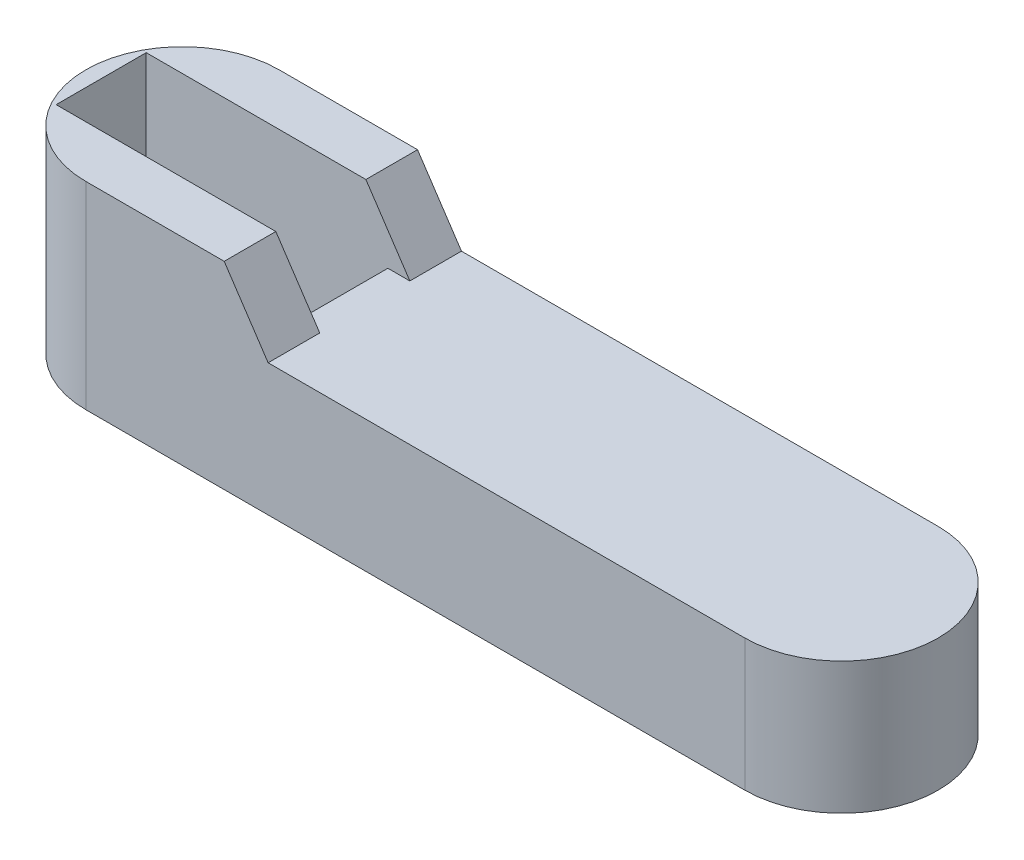
ISO-10303-21;
HEADER;
FILE_DESCRIPTION(('STEP AP214'),'2;1');
FILE_NAME('part.step','',(''),(''),'','','');
FILE_SCHEMA(('AUTOMOTIVE_DESIGN { 1 0 10303 214 1 1 1 1 }'));
ENDSEC;
DATA;
#1=APPLICATION_CONTEXT('core data for automotive mechanical design processes');
#2=APPLICATION_PROTOCOL_DEFINITION('international standard','automotive_design',2000,#1);
#3=PRODUCT_CONTEXT('',#1,'mechanical');
#4=PRODUCT('Part','Part','',(#3));
#5=PRODUCT_RELATED_PRODUCT_CATEGORY('part','',(#4));
#6=PRODUCT_DEFINITION_FORMATION('','',#4);
#7=PRODUCT_DEFINITION_CONTEXT('part definition',#1,'design');
#8=PRODUCT_DEFINITION('design','',#6,#7);
#9=PRODUCT_DEFINITION_SHAPE('','',#8);
#10=(LENGTH_UNIT() NAMED_UNIT(*) SI_UNIT(.MILLI.,.METRE.));
#11=(NAMED_UNIT(*) PLANE_ANGLE_UNIT() SI_UNIT($,.RADIAN.));
#12=(NAMED_UNIT(*) SI_UNIT($,.STERADIAN.) SOLID_ANGLE_UNIT());
#13=UNCERTAINTY_MEASURE_WITH_UNIT(LENGTH_MEASURE(1.E-05),#10,'distance_accuracy_value','');
#14=(GEOMETRIC_REPRESENTATION_CONTEXT(3) GLOBAL_UNCERTAINTY_ASSIGNED_CONTEXT((#13)) GLOBAL_UNIT_ASSIGNED_CONTEXT((#10,
#11,#12)) REPRESENTATION_CONTEXT('',''));
#15=CARTESIAN_POINT('',(0.,0.,0.));
#16=DIRECTION('',(0.,0.,1.));
#17=DIRECTION('',(1.,0.,0.));
#18=AXIS2_PLACEMENT_3D('',#15,#16,#17);
#19=CARTESIAN_POINT('',(150.,4.98,-22.0000000000001));
#20=DIRECTION('',(0.,1.,0.));
#21=DIRECTION('',(0.713138176121958,0.,0.701023495866899));
#22=AXIS2_PLACEMENT_3D('',#19,#20,#21);
#23=PLANE('',#22);
#24=CARTESIAN_POINT('',(150.,4.98,-22.0000000000001));
#25=DIRECTION('',(0.,1.,0.));
#26=DIRECTION('',(0.713138176121958,0.,0.701023495866899));
#27=AXIS2_PLACEMENT_3D('',#24,#25,#26);
#28=CIRCLE('',#27,5.61);
#29=CARTESIAN_POINT('',(154.000705168044,4.98,-18.0672581881868));
#30=VERTEX_POINT('',#29);
#31=EDGE_CURVE('E306',#30,#30,#28,.F.);
#32=ORIENTED_EDGE('',*,*,#31,.F.);
#33=EDGE_LOOP('',(#32));
#34=FACE_BOUND('',#33,.T.);
#35=DIRECTION('',(-0.713138176121948,0.,-0.701023495866908));
#36=VECTOR('',#35,1.);
#37=CARTESIAN_POINT('',(166.268455658429,4.98,-33.7679348859496));
#38=LINE('',#37,#36);
#39=CARTESIAN_POINT('',(166.268455658429,4.97999999999999,-33.7679348859496));
#40=VERTEX_POINT('',#39);
#41=CARTESIAN_POINT('',(161.487494681992,4.97999999999999,-38.4676776420183));
#42=VERTEX_POINT('',#41);
#43=EDGE_CURVE('E63',#40,#42,#38,.T.);
#44=ORIENTED_EDGE('',*,*,#43,.F.);
#45=DIRECTION('',(-0.605125535662141,0.,0.796130068575235));
#46=VECTOR('',#45,1.);
#47=CARTESIAN_POINT('',(159.130639993139,4.98,-24.3771071317262));
#48=LINE('',#47,#46);
#49=CARTESIAN_POINT('',(159.130639993139,4.98,-24.3771071317262));
#50=VERTEX_POINT('',#49);
#51=EDGE_CURVE('E240',#40,#50,#48,.T.);
#52=ORIENTED_EDGE('',*,*,#51,.T.);
#53=CARTESIAN_POINT('',(150.,4.98,-22.0000000000001));
#54=DIRECTION('',(0.,1.,0.));
#55=DIRECTION('',(0.713138176121958,0.,0.701023495866899));
#56=AXIS2_PLACEMENT_3D('',#53,#54,#55);
#57=CIRCLE('',#56,9.435);
#58=CARTESIAN_POINT('',(159.170024806677,4.98,-19.7796689334835));
#59=VERTEX_POINT('',#58);
#60=EDGE_CURVE('E251',#59,#50,#57,.T.);
#61=ORIENTED_EDGE('',*,*,#60,.F.);
#62=DIRECTION('',(0.618676117195959,0.,0.785646143000354));
#63=VECTOR('',#62,1.);
#64=CARTESIAN_POINT('',(169.252017964806,4.98000000000001,-6.97671950925164));
#65=LINE('',#64,#63);
#66=CARTESIAN_POINT('',(166.467677642019,4.98000000000001,-10.5125053180082));
#67=VERTEX_POINT('',#66);
#68=EDGE_CURVE('E503',#59,#67,#65,.T.);
#69=ORIENTED_EDGE('',*,*,#68,.T.);
#70=DIRECTION('',(0.701023495866891,0.,-0.713138176121965));
#71=VECTOR('',#70,1.);
#72=CARTESIAN_POINT('',(161.76793488595,4.98000000000001,-5.73154434157103));
#73=LINE('',#72,#71);
#74=CARTESIAN_POINT('',(161.76793488595,4.98000000000001,-5.73154434157101));
#75=VERTEX_POINT('',#74);
#76=EDGE_CURVE('E575',#75,#67,#73,.T.);
#77=ORIENTED_EDGE('',*,*,#76,.F.);
#78=DIRECTION('',(-0.796130068575241,0.,-0.605125535662133));
#79=VECTOR('',#78,1.);
#80=CARTESIAN_POINT('',(152.377107131726,4.98,-12.8693600068618));
#81=LINE('',#80,#79);
#82=CARTESIAN_POINT('',(152.377107131726,4.98,-12.8693600068618));
#83=VERTEX_POINT('',#82);
#84=EDGE_CURVE('E508',#75,#83,#81,.T.);
#85=ORIENTED_EDGE('',*,*,#84,.T.);
#86=CARTESIAN_POINT('',(150.,4.98,-22.0000000000001));
#87=DIRECTION('',(0.,1.,0.));
#88=DIRECTION('',(0.713138176121958,0.,0.701023495866899));
#89=AXIS2_PLACEMENT_3D('',#86,#87,#88);
#90=CIRCLE('',#89,9.435);
#91=CARTESIAN_POINT('',(147.779668933484,4.98,-12.8299751933236));
#92=VERTEX_POINT('',#91);
#93=EDGE_CURVE('E519',#92,#83,#90,.T.);
#94=ORIENTED_EDGE('',*,*,#93,.F.);
#95=DIRECTION('',(-0.785646143000356,0.,0.618676117195956));
#96=VECTOR('',#95,1.);
#97=CARTESIAN_POINT('',(134.976719509252,4.98,-2.74798203519463));
#98=LINE('',#97,#96);
#99=CARTESIAN_POINT('',(134.976719509252,4.98,-2.74798203519463));
#100=VERTEX_POINT('',#99);
#101=EDGE_CURVE('E526',#92,#100,#98,.T.);
#102=ORIENTED_EDGE('',*,*,#101,.T.);
#103=CARTESIAN_POINT('',(133.241333000517,4.98,-4.95171946631063));
#104=DIRECTION('',(0.,1.,0.));
#105=DIRECTION('',(0.713138176121958,0.,0.701023495866899));
#106=AXIS2_PLACEMENT_3D('',#103,#104,#105);
#107=CIRCLE('',#106,2.805);
#108=CARTESIAN_POINT('',(131.008188158164,4.98,-6.64909659384291));
#109=VERTEX_POINT('',#108);
#110=EDGE_CURVE('E530',#100,#109,#107,.F.);
#111=ORIENTED_EDGE('',*,*,#110,.T.);
#112=DIRECTION('',(0.605125535662135,0.,-0.796130068575239));
#113=VECTOR('',#112,1.);
#114=CARTESIAN_POINT('',(140.869360006862,4.98,-19.6228928682739));
#115=LINE('',#114,#113);
#116=CARTESIAN_POINT('',(140.869360006862,4.98,-19.6228928682739));
#117=VERTEX_POINT('',#116);
#118=EDGE_CURVE('E534',#109,#117,#115,.T.);
#119=ORIENTED_EDGE('',*,*,#118,.T.);
#120=CARTESIAN_POINT('',(150.,4.98,-22.0000000000001));
#121=DIRECTION('',(0.,1.,0.));
#122=DIRECTION('',(0.713138176121958,0.,0.701023495866899));
#123=AXIS2_PLACEMENT_3D('',#120,#121,#122);
#124=CIRCLE('',#123,9.435);
#125=CARTESIAN_POINT('',(140.829975193324,4.98,-24.2203310665166));
#126=VERTEX_POINT('',#125);
#127=EDGE_CURVE('E268',#126,#117,#124,.T.);
#128=ORIENTED_EDGE('',*,*,#127,.F.);
#129=DIRECTION('',(-0.618676117195959,0.,-0.785646143000354));
#130=VECTOR('',#129,1.);
#131=CARTESIAN_POINT('',(130.747982035195,4.97999999999999,-37.0232804907485));
#132=LINE('',#131,#130);
#133=CARTESIAN_POINT('',(130.747982035195,4.97999999999999,-37.0232804907485));
#134=VERTEX_POINT('',#133);
#135=EDGE_CURVE('E259',#126,#134,#132,.T.);
#136=ORIENTED_EDGE('',*,*,#135,.T.);
#137=CARTESIAN_POINT('',(132.951719466311,4.97999999999999,-38.7586669994831));
#138=DIRECTION('',(0.,1.,0.));
#139=DIRECTION('',(0.713138176121958,0.,0.701023495866899));
#140=AXIS2_PLACEMENT_3D('',#137,#138,#139);
#141=CIRCLE('',#140,2.805);
#142=CARTESIAN_POINT('',(134.649096593843,4.97999999999998,-40.9918118418367));
#143=VERTEX_POINT('',#142);
#144=EDGE_CURVE('E523',#134,#143,#141,.F.);
#145=ORIENTED_EDGE('',*,*,#144,.T.);
#146=DIRECTION('',(0.796130068575241,0.,0.605125535662133));
#147=VECTOR('',#146,1.);
#148=CARTESIAN_POINT('',(147.622892868274,4.97999999999999,-31.1306399931384));
#149=LINE('',#148,#147);
#150=CARTESIAN_POINT('',(147.622892868274,4.97999999999999,-31.1306399931384));
#151=VERTEX_POINT('',#150);
#152=EDGE_CURVE('E246',#143,#151,#149,.T.);
#153=ORIENTED_EDGE('',*,*,#152,.T.);
#154=CARTESIAN_POINT('',(150.,4.98,-22.0000000000001));
#155=DIRECTION('',(0.,1.,0.));
#156=DIRECTION('',(0.713138176121958,0.,0.701023495866899));
#157=AXIS2_PLACEMENT_3D('',#154,#155,#156);
#158=CIRCLE('',#157,9.435);
#159=CARTESIAN_POINT('',(152.220331066517,4.97999999999999,-31.1700248066765));
#160=VERTEX_POINT('',#159);
#161=EDGE_CURVE('E244',#160,#151,#158,.T.);
#162=ORIENTED_EDGE('',*,*,#161,.F.);
#163=DIRECTION('',(0.78564614300036,0.,-0.618676117195951));
#164=VECTOR('',#163,1.);
#165=CARTESIAN_POINT('',(165.023280490749,4.97999999999999,-41.2520179648054));
#166=LINE('',#165,#164);
#167=EDGE_CURVE('E231',#160,#42,#166,.T.);
#168=ORIENTED_EDGE('',*,*,#167,.T.);
#169=EDGE_LOOP('',(#44,#52,#61,#69,#77,#85,#94,#102,#111,#119,#128,#136,#145,#153,#162,#168));
#170=FACE_BOUND('',#169,.T.);
#171=ADVANCED_FACE('F47',(#34,#170),#23,.F.);
#172=CARTESIAN_POINT('',(159.130639993139,26.9860507242311,-24.3771071317262));
#173=DIRECTION('',(0.796130068575234,0.,0.605125535662141));
#174=DIRECTION('',(-0.605125535662141,0.,0.796130068575235));
#175=AXIS2_PLACEMENT_3D('',#172,#173,#174);
#176=PLANE('',#175);
#177=DIRECTION('',(0.,1.,0.));
#178=VECTOR('',#177,1.);
#179=CARTESIAN_POINT('',(166.268455658429,-8.4346735993157,-33.7679348859495));
#180=LINE('',#179,#178);
#181=CARTESIAN_POINT('',(166.268455658429,0.,-33.7679348859495));
#182=VERTEX_POINT('',#181);
#183=EDGE_CURVE('E70',#182,#40,#180,.T.);
#184=ORIENTED_EDGE('',*,*,#183,.F.);
#185=DIRECTION('',(-0.605125535662141,0.,0.796130068575234));
#186=VECTOR('',#185,1.);
#187=CARTESIAN_POINT('',(99.71548144673,0.,53.7921180294656));
#188=LINE('',#187,#186);
#189=CARTESIAN_POINT('',(159.130639993139,0.,-24.3771071317262));
#190=VERTEX_POINT('',#189);
#191=EDGE_CURVE('E483',#182,#190,#188,.T.);
#192=ORIENTED_EDGE('',*,*,#191,.T.);
#193=DIRECTION('',(0.,-1.,0.));
#194=VECTOR('',#193,1.);
#195=CARTESIAN_POINT('',(159.130639993139,26.9860507242311,-24.3771071317262));
#196=LINE('',#195,#194);
#197=EDGE_CURVE('E258',#50,#190,#196,.T.);
#198=ORIENTED_EDGE('',*,*,#197,.F.);
#199=ORIENTED_EDGE('',*,*,#51,.F.);
#200=EDGE_LOOP('',(#184,#192,#198,#199));
#201=FACE_BOUND('',#200,.T.);
#202=ADVANCED_FACE('F642',(#201),#176,.F.);
#203=CARTESIAN_POINT('',(165.023280490749,26.9860507242311,-41.2520179648054));
#204=DIRECTION('',(-0.61867611719595,0.,-0.785646143000361));
#205=DIRECTION('',(0.78564614300036,0.,-0.618676117195951));
#206=AXIS2_PLACEMENT_3D('',#203,#204,#205);
#207=PLANE('',#206);
#208=DIRECTION('',(0.,1.,0.));
#209=VECTOR('',#208,1.);
#210=CARTESIAN_POINT('',(161.487494681992,-8.4346735993157,-38.4676776420183));
#211=LINE('',#210,#209);
#212=CARTESIAN_POINT('',(161.487494681992,0.,-38.4676776420183));
#213=VERTEX_POINT('',#212);
#214=EDGE_CURVE('E238',#213,#42,#211,.T.);
#215=ORIENTED_EDGE('',*,*,#214,.T.);
#216=ORIENTED_EDGE('',*,*,#167,.F.);
#217=DIRECTION('',(0.,-1.,0.));
#218=VECTOR('',#217,1.);
#219=CARTESIAN_POINT('',(152.220331066517,26.9860507242311,-31.1700248066765));
#220=LINE('',#219,#218);
#221=CARTESIAN_POINT('',(152.220331066517,0.,-31.1700248066765));
#222=VERTEX_POINT('',#221);
#223=EDGE_CURVE('E235',#160,#222,#220,.T.);
#224=ORIENTED_EDGE('',*,*,#223,.T.);
#225=DIRECTION('',(0.785646143000361,0.,-0.61867611719595));
#226=VECTOR('',#225,1.);
#227=CARTESIAN_POINT('',(53.8066880330894,0.,46.3281861798965));
#228=LINE('',#227,#226);
#229=EDGE_CURVE('E449',#222,#213,#228,.T.);
#230=ORIENTED_EDGE('',*,*,#229,.T.);
#231=EDGE_LOOP('',(#215,#216,#224,#230));
#232=FACE_BOUND('',#231,.T.);
#233=ADVANCED_FACE('F233',(#232),#207,.F.);
#234=CARTESIAN_POINT('',(152.377107131726,26.9860507242311,-12.8693600068618));
#235=DIRECTION('',(-0.605125535662132,0.,0.796130068575241));
#236=DIRECTION('',(-0.796130068575241,0.,-0.605125535662133));
#237=AXIS2_PLACEMENT_3D('',#234,#235,#236);
#238=PLANE('',#237);
#239=DIRECTION('',(0.,1.,0.));
#240=VECTOR('',#239,1.);
#241=CARTESIAN_POINT('',(161.76793488595,-8.43467359931569,-5.73154434157103));
#242=LINE('',#241,#240);
#243=CARTESIAN_POINT('',(161.76793488595,0.,-5.73154434157103));
#244=VERTEX_POINT('',#243);
#245=EDGE_CURVE('E573',#244,#75,#242,.T.);
#246=ORIENTED_EDGE('',*,*,#245,.F.);
#247=DIRECTION('',(-0.796130068575241,0.,-0.605125535662132));
#248=VECTOR('',#247,1.);
#249=CARTESIAN_POINT('',(51.3982141875908,0.,-89.6217765972098));
#250=LINE('',#249,#248);
#251=CARTESIAN_POINT('',(152.377107131726,0.,-12.8693600068618));
#252=VERTEX_POINT('',#251);
#253=EDGE_CURVE('E480',#244,#252,#250,.T.);
#254=ORIENTED_EDGE('',*,*,#253,.T.);
#255=DIRECTION('',(0.,-1.,0.));
#256=VECTOR('',#255,1.);
#257=CARTESIAN_POINT('',(152.377107131726,26.9860507242311,-12.8693600068618));
#258=LINE('',#257,#256);
#259=EDGE_CURVE('E302',#83,#252,#258,.T.);
#260=ORIENTED_EDGE('',*,*,#259,.F.);
#261=ORIENTED_EDGE('',*,*,#84,.F.);
#262=EDGE_LOOP('',(#246,#254,#260,#261));
#263=FACE_BOUND('',#262,.T.);
#264=ADVANCED_FACE('F656',(#263),#238,.F.);
#265=CARTESIAN_POINT('',(169.252017964806,26.9860507242311,-6.97671950925165));
#266=DIRECTION('',(0.785646143000354,0.,-0.618676117195959));
#267=DIRECTION('',(0.618676117195959,0.,0.785646143000354));
#268=AXIS2_PLACEMENT_3D('',#265,#266,#267);
#269=PLANE('',#268);
#270=DIRECTION('',(0.,1.,0.));
#271=VECTOR('',#270,1.);
#272=CARTESIAN_POINT('',(166.467677642019,-8.43467359931569,-10.5125053180082));
#273=LINE('',#272,#271);
#274=CARTESIAN_POINT('',(166.467677642019,0.,-10.5125053180082));
#275=VERTEX_POINT('',#274);
#276=EDGE_CURVE('E505',#275,#67,#273,.T.);
#277=ORIENTED_EDGE('',*,*,#276,.T.);
#278=ORIENTED_EDGE('',*,*,#68,.F.);
#279=DIRECTION('',(0.,-1.,0.));
#280=VECTOR('',#279,1.);
#281=CARTESIAN_POINT('',(159.170024806677,26.9860507242311,-19.7796689334835));
#282=LINE('',#281,#280);
#283=CARTESIAN_POINT('',(159.170024806677,0.,-19.7796689334835));
#284=VERTEX_POINT('',#283);
#285=EDGE_CURVE('E290',#59,#284,#282,.T.);
#286=ORIENTED_EDGE('',*,*,#285,.T.);
#287=DIRECTION('',(0.618676117195959,0.,0.785646143000354));
#288=VECTOR('',#287,1.);
#289=CARTESIAN_POINT('',(97.1668689080193,0.,-98.5164084514254));
#290=LINE('',#289,#288);
#291=EDGE_CURVE('E11',#284,#275,#290,.T.);
#292=ORIENTED_EDGE('',*,*,#291,.T.);
#293=EDGE_LOOP('',(#277,#278,#286,#292));
#294=FACE_BOUND('',#293,.T.);
#295=ADVANCED_FACE('F500',(#294),#269,.F.);
#296=CARTESIAN_POINT('',(150.,4.98,-22.0000000000001));
#297=DIRECTION('',(0.,1.,0.));
#298=DIRECTION('',(0.713138176121958,0.,0.701023495866899));
#299=AXIS2_PLACEMENT_3D('',#296,#297,#298);
#300=CYLINDRICAL_SURFACE('',#299,2.805);
#301=CARTESIAN_POINT('',(150.,6.,-22.0000000000001));
#302=DIRECTION('',(0.,1.,0.));
#303=DIRECTION('',(0.713138176121958,0.,0.701023495866899));
#304=AXIS2_PLACEMENT_3D('',#301,#302,#303);
#305=CIRCLE('',#304,2.805);
#306=CARTESIAN_POINT('',(152.000352584022,6.,-20.0336290940934));
#307=VERTEX_POINT('',#306);
#308=EDGE_CURVE('E590',#307,#307,#305,.T.);
#309=ORIENTED_EDGE('',*,*,#308,.F.);
#310=EDGE_LOOP('',(#309));
#311=FACE_BOUND('',#310,.T.);
#312=CARTESIAN_POINT('',(150.,5.98,-22.0000000000001));
#313=DIRECTION('',(0.,-1.,0.));
#314=DIRECTION('',(0.,0.,-1.));
#315=AXIS2_PLACEMENT_3D('',#312,#313,#314);
#316=CIRCLE('',#315,2.805);
#317=CARTESIAN_POINT('',(150.,5.98,-24.8050000000001));
#318=VERTEX_POINT('',#317);
#319=EDGE_CURVE('E581',#318,#318,#316,.T.);
#320=ORIENTED_EDGE('',*,*,#319,.F.);
#321=EDGE_LOOP('',(#320));
#322=FACE_BOUND('',#321,.T.);
#323=ADVANCED_FACE('F651',(#311,#322),#300,.T.);
#324=CARTESIAN_POINT('',(0.,0.,-22.));
#325=DIRECTION('',(0.,-1.,0.));
#326=DIRECTION('',(0.,0.,-1.));
#327=AXIS2_PLACEMENT_3D('',#324,#325,#326);
#328=PLANE('',#327);
#329=ORIENTED_EDGE('',*,*,#191,.F.);
#330=DIRECTION('',(-0.713138176121948,0.,-0.701023495866908));
#331=VECTOR('',#330,1.);
#332=CARTESIAN_POINT('',(166.268455658429,0.,-33.7679348859495));
#333=LINE('',#332,#331);
#334=EDGE_CURVE('E562',#182,#213,#333,.T.);
#335=ORIENTED_EDGE('',*,*,#334,.T.);
#336=ORIENTED_EDGE('',*,*,#229,.F.);
#337=CARTESIAN_POINT('',(150.,0.,-22.0000000000001));
#338=DIRECTION('',(0.,-1.,0.));
#339=DIRECTION('',(0.,0.,-1.));
#340=AXIS2_PLACEMENT_3D('',#337,#338,#339);
#341=CIRCLE('',#340,9.435);
#342=CARTESIAN_POINT('',(147.622892868274,0.,-31.1306399931383));
#343=VERTEX_POINT('',#342);
#344=EDGE_CURVE('E255',#222,#343,#341,.F.);
#345=ORIENTED_EDGE('',*,*,#344,.T.);
#346=DIRECTION('',(0.796130068575241,0.,0.605125535662132));
#347=VECTOR('',#346,1.);
#348=CARTESIAN_POINT('',(58.4548599855242,0.,-98.9058136637873));
#349=LINE('',#348,#347);
#350=CARTESIAN_POINT('',(134.649096593843,0.,-40.9918118418367));
#351=VERTEX_POINT('',#350);
#352=EDGE_CURVE('E454',#351,#343,#349,.T.);
#353=ORIENTED_EDGE('',*,*,#352,.F.);
#354=CARTESIAN_POINT('',(132.951719466311,0.,-38.7586669994831));
#355=DIRECTION('',(0.,-1.,0.));
#356=DIRECTION('',(0.,0.,-1.));
#357=AXIS2_PLACEMENT_3D('',#354,#355,#356);
#358=CIRCLE('',#357,2.805);
#359=CARTESIAN_POINT('',(130.747982035195,0.,-37.0232804907485));
#360=VERTEX_POINT('',#359);
#361=EDGE_CURVE('E457',#360,#351,#358,.T.);
#362=ORIENTED_EDGE('',*,*,#361,.F.);
#363=DIRECTION('',(-0.618676117195959,0.,-0.785646143000354));
#364=VECTOR('',#363,1.);
#365=CARTESIAN_POINT('',(88.0050896953809,0.,-91.3017431210068));
#366=LINE('',#365,#364);
#367=CARTESIAN_POINT('',(140.829975193324,0.,-24.2203310665166));
#368=VERTEX_POINT('',#367);
#369=EDGE_CURVE('E460',#368,#360,#366,.T.);
#370=ORIENTED_EDGE('',*,*,#369,.F.);
#371=CARTESIAN_POINT('',(150.,0.,-22.0000000000001));
#372=DIRECTION('',(0.,-1.,0.));
#373=DIRECTION('',(0.,0.,-1.));
#374=AXIS2_PLACEMENT_3D('',#371,#372,#373);
#375=CIRCLE('',#374,9.435);
#376=CARTESIAN_POINT('',(140.869360006862,0.,-19.6228928682739));
#377=VERTEX_POINT('',#376);
#378=EDGE_CURVE('E463',#368,#377,#375,.F.);
#379=ORIENTED_EDGE('',*,*,#378,.T.);
#380=DIRECTION('',(0.605125535662135,0.,-0.796130068575239));
#381=VECTOR('',#380,1.);
#382=CARTESIAN_POINT('',(90.4314443801534,0.,46.7354722315319));
#383=LINE('',#382,#381);
#384=CARTESIAN_POINT('',(131.008188158164,0.,-6.64909659384291));
#385=VERTEX_POINT('',#384);
#386=EDGE_CURVE('E467',#385,#377,#383,.T.);
#387=ORIENTED_EDGE('',*,*,#386,.F.);
#388=CARTESIAN_POINT('',(133.241333000517,0.,-4.95171946631062));
#389=DIRECTION('',(0.,-1.,0.));
#390=DIRECTION('',(0.,0.,-1.));
#391=AXIS2_PLACEMENT_3D('',#388,#389,#390);
#392=CIRCLE('',#391,2.805);
#393=CARTESIAN_POINT('',(134.976719509252,0.,-2.74798203519462));
#394=VERTEX_POINT('',#393);
#395=EDGE_CURVE('E470',#394,#385,#392,.T.);
#396=ORIENTED_EDGE('',*,*,#395,.F.);
#397=DIRECTION('',(-0.785646143000356,0.,0.618676117195956));
#398=VECTOR('',#397,1.);
#399=CARTESIAN_POINT('',(61.021353363509,0.,55.4899653925351));
#400=LINE('',#399,#398);
#401=CARTESIAN_POINT('',(147.779668933484,0.,-12.8299751933236));
#402=VERTEX_POINT('',#401);
#403=EDGE_CURVE('E473',#402,#394,#400,.T.);
#404=ORIENTED_EDGE('',*,*,#403,.F.);
#405=CARTESIAN_POINT('',(150.,0.,-22.0000000000001));
#406=DIRECTION('',(0.,-1.,0.));
#407=DIRECTION('',(0.,0.,-1.));
#408=AXIS2_PLACEMENT_3D('',#405,#406,#407);
#409=CIRCLE('',#408,9.435);
#410=EDGE_CURVE('E476',#402,#252,#409,.F.);
#411=ORIENTED_EDGE('',*,*,#410,.T.);
#412=ORIENTED_EDGE('',*,*,#253,.F.);
#413=DIRECTION('',(0.701023495866891,0.,-0.713138176121965));
#414=VECTOR('',#413,1.);
#415=CARTESIAN_POINT('',(161.76793488595,0.,-5.73154434157103));
#416=LINE('',#415,#414);
#417=EDGE_CURVE('E578',#244,#275,#416,.T.);
#418=ORIENTED_EDGE('',*,*,#417,.T.);
#419=ORIENTED_EDGE('',*,*,#291,.F.);
#420=CARTESIAN_POINT('',(150.,0.,-22.0000000000001));
#421=DIRECTION('',(0.,-1.,0.));
#422=DIRECTION('',(0.,0.,-1.));
#423=AXIS2_PLACEMENT_3D('',#420,#421,#422);
#424=CIRCLE('',#423,9.435);
#425=EDGE_CURVE('E56',#284,#190,#424,.F.);
#426=ORIENTED_EDGE('',*,*,#425,.T.);
#427=EDGE_LOOP('',(#329,#335,#336,#345,#353,#362,#370,#379,#387,#396,#404,#411,#412,#418,#419,#426));
#428=FACE_BOUND('',#427,.T.);
#429=DIRECTION('',(-1.,0.,0.));
#430=VECTOR('',#429,1.);
#431=CARTESIAN_POINT('',(0.,0.,-44.));
#432=LINE('',#431,#430);
#433=CARTESIAN_POINT('',(150.,0.,-44.));
#434=VERTEX_POINT('',#433);
#435=CARTESIAN_POINT('',(0.,0.,-44.));
#436=VERTEX_POINT('',#435);
#437=EDGE_CURVE('E411',#434,#436,#432,.T.);
#438=ORIENTED_EDGE('',*,*,#437,.F.);
#439=CARTESIAN_POINT('',(150.,0.,-22.));
#440=DIRECTION('',(0.,1.,0.));
#441=DIRECTION('',(0.,0.,-1.));
#442=AXIS2_PLACEMENT_3D('',#439,#440,#441);
#443=CIRCLE('',#442,22.);
#444=CARTESIAN_POINT('',(150.,0.,0.));
#445=VERTEX_POINT('',#444);
#446=EDGE_CURVE('E425',#445,#434,#443,.T.);
#447=ORIENTED_EDGE('',*,*,#446,.F.);
#448=DIRECTION('',(1.,0.,0.));
#449=VECTOR('',#448,1.);
#450=CARTESIAN_POINT('',(0.,0.,0.));
#451=LINE('',#450,#449);
#452=CARTESIAN_POINT('',(0.,0.,0.));
#453=VERTEX_POINT('',#452);
#454=EDGE_CURVE('E422',#453,#445,#451,.T.);
#455=ORIENTED_EDGE('',*,*,#454,.F.);
#456=CARTESIAN_POINT('',(0.,0.,-22.));
#457=DIRECTION('',(0.,1.,0.));
#458=DIRECTION('',(0.,0.,-1.));
#459=AXIS2_PLACEMENT_3D('',#456,#457,#458);
#460=CIRCLE('',#459,22.);
#461=EDGE_CURVE('E406',#436,#453,#460,.T.);
#462=ORIENTED_EDGE('',*,*,#461,.F.);
#463=EDGE_LOOP('',(#438,#447,#455,#462));
#464=FACE_BOUND('',#463,.T.);
#465=CARTESIAN_POINT('',(0.,0.,-22.));
#466=DIRECTION('',(0.,1.,0.));
#467=DIRECTION('',(0.,0.,1.));
#468=AXIS2_PLACEMENT_3D('',#465,#466,#467);
#469=CIRCLE('',#468,7.);
#470=CARTESIAN_POINT('',(0.,0.,-15.));
#471=VERTEX_POINT('',#470);
#472=EDGE_CURVE('E402',#471,#471,#469,.T.);
#473=ORIENTED_EDGE('',*,*,#472,.T.);
#474=EDGE_LOOP('',(#473));
#475=FACE_BOUND('',#474,.T.);
#476=ADVANCED_FACE('F489',(#428,#464,#475),#328,.T.);
#477=CARTESIAN_POINT('',(0.,30.,-22.));
#478=DIRECTION('',(0.,-1.,0.));
#479=DIRECTION('',(0.,0.,-1.));
#480=AXIS2_PLACEMENT_3D('',#477,#478,#479);
#481=PLANE('',#480);
#482=DIRECTION('',(0.,0.,-1.));
#483=VECTOR('',#482,1.);
#484=CARTESIAN_POINT('',(41.5,30.,-44.));
#485=LINE('',#484,#483);
#486=CARTESIAN_POINT('',(41.5,30.,-32.25));
#487=VERTEX_POINT('',#486);
#488=CARTESIAN_POINT('',(41.5,30.,-44.));
#489=VERTEX_POINT('',#488);
#490=EDGE_CURVE('E331',#487,#489,#485,.T.);
#491=ORIENTED_EDGE('',*,*,#490,.F.);
#492=DIRECTION('',(1.,0.,0.));
#493=VECTOR('',#492,1.);
#494=CARTESIAN_POINT('',(41.5,30.,-32.25));
#495=LINE('',#494,#493);
#496=CARTESIAN_POINT('',(36.5,30.,-32.25));
#497=VERTEX_POINT('',#496);
#498=EDGE_CURVE('E356',#497,#487,#495,.T.);
#499=ORIENTED_EDGE('',*,*,#498,.F.);
#500=DIRECTION('',(0.,0.,-1.));
#501=VECTOR('',#500,1.);
#502=CARTESIAN_POINT('',(36.5,30.,-11.75));
#503=LINE('',#502,#501);
#504=CARTESIAN_POINT('',(36.5,30.,-11.75));
#505=VERTEX_POINT('',#504);
#506=EDGE_CURVE('E355',#505,#497,#503,.T.);
#507=ORIENTED_EDGE('',*,*,#506,.F.);
#508=DIRECTION('',(-1.,0.,0.));
#509=VECTOR('',#508,1.);
#510=CARTESIAN_POINT('',(-18.5,30.,-11.75));
#511=LINE('',#510,#509);
#512=CARTESIAN_POINT('',(41.5,30.,-11.75));
#513=VERTEX_POINT('',#512);
#514=EDGE_CURVE('E337',#513,#505,#511,.T.);
#515=ORIENTED_EDGE('',*,*,#514,.F.);
#516=DIRECTION('',(0.,0.,-1.));
#517=VECTOR('',#516,1.);
#518=CARTESIAN_POINT('',(41.5,30.,0.));
#519=LINE('',#518,#517);
#520=CARTESIAN_POINT('',(41.5,30.,0.));
#521=VERTEX_POINT('',#520);
#522=EDGE_CURVE('E364',#521,#513,#519,.T.);
#523=ORIENTED_EDGE('',*,*,#522,.F.);
#524=DIRECTION('',(1.,0.,0.));
#525=VECTOR('',#524,1.);
#526=CARTESIAN_POINT('',(0.,30.,0.));
#527=LINE('',#526,#525);
#528=CARTESIAN_POINT('',(150.,30.,0.));
#529=VERTEX_POINT('',#528);
#530=EDGE_CURVE('E407',#521,#529,#527,.T.);
#531=ORIENTED_EDGE('',*,*,#530,.T.);
#532=CARTESIAN_POINT('',(150.,30.,-22.));
#533=DIRECTION('',(0.,1.,0.));
#534=DIRECTION('',(0.,0.,-1.));
#535=AXIS2_PLACEMENT_3D('',#532,#533,#534);
#536=CIRCLE('',#535,22.);
#537=CARTESIAN_POINT('',(150.,30.,-44.));
#538=VERTEX_POINT('',#537);
#539=EDGE_CURVE('E410',#529,#538,#536,.T.);
#540=ORIENTED_EDGE('',*,*,#539,.T.);
#541=DIRECTION('',(-1.,0.,0.));
#542=VECTOR('',#541,1.);
#543=CARTESIAN_POINT('',(0.,30.,-44.));
#544=LINE('',#543,#542);
#545=EDGE_CURVE('E414',#538,#489,#544,.T.);
#546=ORIENTED_EDGE('',*,*,#545,.T.);
#547=EDGE_LOOP('',(#491,#499,#507,#515,#523,#531,#540,#546));
#548=FACE_BOUND('',#547,.T.);
#549=ADVANCED_FACE('F682',(#548),#481,.F.);
#550=CARTESIAN_POINT('',(0.,0.,-22.));
#551=DIRECTION('',(0.,1.,0.));
#552=DIRECTION('',(0.,0.,1.));
#553=AXIS2_PLACEMENT_3D('',#550,#551,#552);
#554=CYLINDRICAL_SURFACE('',#553,7.);
#555=ORIENTED_EDGE('',*,*,#472,.F.);
#556=EDGE_LOOP('',(#555));
#557=FACE_BOUND('',#556,.T.);
#558=CARTESIAN_POINT('',(0.,1.5,-22.));
#559=DIRECTION('',(0.,1.,0.));
#560=DIRECTION('',(0.,0.,1.));
#561=AXIS2_PLACEMENT_3D('',#558,#559,#560);
#562=CIRCLE('',#561,7.);
#563=CARTESIAN_POINT('',(0.,1.5,-15.));
#564=VERTEX_POINT('',#563);
#565=EDGE_CURVE('E392',#564,#564,#562,.F.);
#566=ORIENTED_EDGE('',*,*,#565,.F.);
#567=EDGE_LOOP('',(#566));
#568=FACE_BOUND('',#567,.T.);
#569=ADVANCED_FACE('F939',(#557,#568),#554,.F.);
#570=CARTESIAN_POINT('',(0.,30.,-22.));
#571=DIRECTION('',(0.,-1.,0.));
#572=DIRECTION('',(0.,0.,-1.));
#573=AXIS2_PLACEMENT_3D('',#570,#571,#572);
#574=CYLINDRICAL_SURFACE('',#573,22.);
#575=ORIENTED_EDGE('',*,*,#461,.T.);
#576=DIRECTION('',(0.,-1.,0.));
#577=VECTOR('',#576,1.);
#578=CARTESIAN_POINT('',(0.,30.,0.));
#579=LINE('',#578,#577);
#580=CARTESIAN_POINT('',(0.,45.,0.));
#581=VERTEX_POINT('',#580);
#582=EDGE_CURVE('E361',#581,#453,#579,.T.);
#583=ORIENTED_EDGE('',*,*,#582,.F.);
#584=CARTESIAN_POINT('',(0.,45.,-22.));
#585=DIRECTION('',(0.,1.,0.));
#586=DIRECTION('',(0.,0.,1.));
#587=AXIS2_PLACEMENT_3D('',#584,#585,#586);
#588=CIRCLE('',#587,22.);
#589=CARTESIAN_POINT('',(0.,45.,-44.));
#590=VERTEX_POINT('',#589);
#591=EDGE_CURVE('E340',#590,#581,#588,.T.);
#592=ORIENTED_EDGE('',*,*,#591,.F.);
#593=DIRECTION('',(0.,-1.,0.));
#594=VECTOR('',#593,1.);
#595=CARTESIAN_POINT('',(0.,30.,-44.));
#596=LINE('',#595,#594);
#597=EDGE_CURVE('E418',#590,#436,#596,.T.);
#598=ORIENTED_EDGE('',*,*,#597,.T.);
#599=EDGE_LOOP('',(#575,#583,#592,#598));
#600=FACE_BOUND('',#599,.T.);
#601=ADVANCED_FACE('F49',(#600),#574,.T.);
#602=CARTESIAN_POINT('',(0.,30.,0.));
#603=DIRECTION('',(0.,0.,-1.));
#604=DIRECTION('',(-1.,0.,0.));
#605=AXIS2_PLACEMENT_3D('',#602,#603,#604);
#606=PLANE('',#605);
#607=ORIENTED_EDGE('',*,*,#530,.F.);
#608=DIRECTION('',(0.554700196225229,-0.832050294337843,0.));
#609=VECTOR('',#608,1.);
#610=CARTESIAN_POINT('',(41.5,30.,0.));
#611=LINE('',#610,#609);
#612=CARTESIAN_POINT('',(31.5,45.,0.));
#613=VERTEX_POINT('',#612);
#614=EDGE_CURVE('E313',#613,#521,#611,.T.);
#615=ORIENTED_EDGE('',*,*,#614,.F.);
#616=DIRECTION('',(1.,0.,0.));
#617=VECTOR('',#616,1.);
#618=CARTESIAN_POINT('',(41.5,45.,0.));
#619=LINE('',#618,#617);
#620=EDGE_CURVE('E344',#581,#613,#619,.T.);
#621=ORIENTED_EDGE('',*,*,#620,.F.);
#622=ORIENTED_EDGE('',*,*,#582,.T.);
#623=ORIENTED_EDGE('',*,*,#454,.T.);
#624=DIRECTION('',(0.,-1.,0.));
#625=VECTOR('',#624,1.);
#626=CARTESIAN_POINT('',(150.,30.,0.));
#627=LINE('',#626,#625);
#628=EDGE_CURVE('E437',#529,#445,#627,.T.);
#629=ORIENTED_EDGE('',*,*,#628,.F.);
#630=EDGE_LOOP('',(#607,#615,#621,#622,#623,#629));
#631=FACE_BOUND('',#630,.T.);
#632=ADVANCED_FACE('F715',(#631),#606,.F.);
#633=CARTESIAN_POINT('',(150.,30.,-22.));
#634=DIRECTION('',(0.,-1.,0.));
#635=DIRECTION('',(0.,0.,-1.));
#636=AXIS2_PLACEMENT_3D('',#633,#634,#635);
#637=CYLINDRICAL_SURFACE('',#636,22.);
#638=ORIENTED_EDGE('',*,*,#446,.T.);
#639=DIRECTION('',(0.,-1.,0.));
#640=VECTOR('',#639,1.);
#641=CARTESIAN_POINT('',(150.,30.,-44.));
#642=LINE('',#641,#640);
#643=EDGE_CURVE('E433',#538,#434,#642,.T.);
#644=ORIENTED_EDGE('',*,*,#643,.F.);
#645=ORIENTED_EDGE('',*,*,#539,.F.);
#646=ORIENTED_EDGE('',*,*,#628,.T.);
#647=EDGE_LOOP('',(#638,#644,#645,#646));
#648=FACE_BOUND('',#647,.T.);
#649=ADVANCED_FACE('F710',(#648),#637,.T.);
#650=CARTESIAN_POINT('',(0.,30.,-44.));
#651=DIRECTION('',(0.,0.,1.));
#652=DIRECTION('',(1.,0.,0.));
#653=AXIS2_PLACEMENT_3D('',#650,#651,#652);
#654=PLANE('',#653);
#655=DIRECTION('',(-1.,0.,0.));
#656=VECTOR('',#655,1.);
#657=CARTESIAN_POINT('',(0.,45.,-44.));
#658=LINE('',#657,#656);
#659=CARTESIAN_POINT('',(31.5,45.,-44.));
#660=VERTEX_POINT('',#659);
#661=EDGE_CURVE('E336',#660,#590,#658,.T.);
#662=ORIENTED_EDGE('',*,*,#661,.F.);
#663=DIRECTION('',(0.554700196225229,-0.832050294337843,0.));
#664=VECTOR('',#663,1.);
#665=CARTESIAN_POINT('',(41.5,30.,-44.));
#666=LINE('',#665,#664);
#667=EDGE_CURVE('E314',#660,#489,#666,.T.);
#668=ORIENTED_EDGE('',*,*,#667,.T.);
#669=ORIENTED_EDGE('',*,*,#545,.F.);
#670=ORIENTED_EDGE('',*,*,#643,.T.);
#671=ORIENTED_EDGE('',*,*,#437,.T.);
#672=ORIENTED_EDGE('',*,*,#597,.F.);
#673=EDGE_LOOP('',(#662,#668,#669,#670,#671,#672));
#674=FACE_BOUND('',#673,.T.);
#675=ADVANCED_FACE('F714',(#674),#654,.F.);
#676=CARTESIAN_POINT('',(0.,1.5,0.));
#677=DIRECTION('',(0.,1.,0.));
#678=DIRECTION('',(0.,0.,1.));
#679=AXIS2_PLACEMENT_3D('',#676,#677,#678);
#680=PLANE('',#679);
#681=DIRECTION('',(-1.,0.,0.));
#682=VECTOR('',#681,1.);
#683=CARTESIAN_POINT('',(36.5,1.5,-32.25));
#684=LINE('',#683,#682);
#685=CARTESIAN_POINT('',(36.5,1.5,-32.25));
#686=VERTEX_POINT('',#685);
#687=CARTESIAN_POINT('',(-18.5,1.5,-32.25));
#688=VERTEX_POINT('',#687);
#689=EDGE_CURVE('E370',#686,#688,#684,.T.);
#690=ORIENTED_EDGE('',*,*,#689,.T.);
#691=DIRECTION('',(0.,0.,1.));
#692=VECTOR('',#691,1.);
#693=CARTESIAN_POINT('',(-18.5,1.5,-32.25));
#694=LINE('',#693,#692);
#695=CARTESIAN_POINT('',(-18.5,1.5,-11.75));
#696=VERTEX_POINT('',#695);
#697=EDGE_CURVE('E373',#688,#696,#694,.T.);
#698=ORIENTED_EDGE('',*,*,#697,.T.);
#699=DIRECTION('',(1.,0.,0.));
#700=VECTOR('',#699,1.);
#701=CARTESIAN_POINT('',(-18.5,1.5,-11.75));
#702=LINE('',#701,#700);
#703=CARTESIAN_POINT('',(36.5,1.5,-11.75));
#704=VERTEX_POINT('',#703);
#705=EDGE_CURVE('E377',#696,#704,#702,.T.);
#706=ORIENTED_EDGE('',*,*,#705,.T.);
#707=DIRECTION('',(0.,0.,-1.));
#708=VECTOR('',#707,1.);
#709=CARTESIAN_POINT('',(36.5,1.5,-11.75));
#710=LINE('',#709,#708);
#711=EDGE_CURVE('E380',#704,#686,#710,.T.);
#712=ORIENTED_EDGE('',*,*,#711,.T.);
#713=EDGE_LOOP('',(#690,#698,#706,#712));
#714=FACE_BOUND('',#713,.T.);
#715=ORIENTED_EDGE('',*,*,#565,.T.);
#716=EDGE_LOOP('',(#715));
#717=FACE_BOUND('',#716,.T.);
#718=ADVANCED_FACE('F918',(#714,#717),#680,.T.);
#719=CARTESIAN_POINT('',(36.5,1.5,-11.75));
#720=DIRECTION('',(1.,0.,0.));
#721=DIRECTION('',(0.,0.,-1.));
#722=AXIS2_PLACEMENT_3D('',#719,#720,#721);
#723=PLANE('',#722);
#724=ORIENTED_EDGE('',*,*,#506,.T.);
#725=DIRECTION('',(0.,1.,0.));
#726=VECTOR('',#725,1.);
#727=CARTESIAN_POINT('',(36.5,1.5,-32.25));
#728=LINE('',#727,#726);
#729=EDGE_CURVE('E388',#686,#497,#728,.T.);
#730=ORIENTED_EDGE('',*,*,#729,.F.);
#731=ORIENTED_EDGE('',*,*,#711,.F.);
#732=DIRECTION('',(0.,1.,0.));
#733=VECTOR('',#732,1.);
#734=CARTESIAN_POINT('',(36.5,1.5,-11.75));
#735=LINE('',#734,#733);
#736=EDGE_CURVE('E393',#704,#505,#735,.T.);
#737=ORIENTED_EDGE('',*,*,#736,.T.);
#738=EDGE_LOOP('',(#724,#730,#731,#737));
#739=FACE_BOUND('',#738,.T.);
#740=ADVANCED_FACE('F907',(#739),#723,.F.);
#741=CARTESIAN_POINT('',(0.,1.5,-11.75));
#742=DIRECTION('',(0.,0.,1.));
#743=DIRECTION('',(1.,0.,0.));
#744=AXIS2_PLACEMENT_3D('',#741,#742,#743);
#745=PLANE('',#744);
#746=DIRECTION('',(-1.,0.,0.));
#747=VECTOR('',#746,1.);
#748=CARTESIAN_POINT('',(-18.5,45.,-11.75));
#749=LINE('',#748,#747);
#750=CARTESIAN_POINT('',(31.5,45.,-11.75));
#751=VERTEX_POINT('',#750);
#752=CARTESIAN_POINT('',(-18.5,45.,-11.75));
#753=VERTEX_POINT('',#752);
#754=EDGE_CURVE('E348',#751,#753,#749,.T.);
#755=ORIENTED_EDGE('',*,*,#754,.F.);
#756=DIRECTION('',(0.554700196225229,-0.832050294337844,0.));
#757=VECTOR('',#756,1.);
#758=CARTESIAN_POINT('',(41.8846153846154,29.4230769230769,-11.75));
#759=LINE('',#758,#757);
#760=EDGE_CURVE('E327',#751,#513,#759,.T.);
#761=ORIENTED_EDGE('',*,*,#760,.T.);
#762=ORIENTED_EDGE('',*,*,#514,.T.);
#763=ORIENTED_EDGE('',*,*,#736,.F.);
#764=ORIENTED_EDGE('',*,*,#705,.F.);
#765=DIRECTION('',(0.,1.,0.));
#766=VECTOR('',#765,1.);
#767=CARTESIAN_POINT('',(-18.5,1.5,-11.75));
#768=LINE('',#767,#766);
#769=EDGE_CURVE('E396',#696,#753,#768,.T.);
#770=ORIENTED_EDGE('',*,*,#769,.T.);
#771=EDGE_LOOP('',(#755,#761,#762,#763,#764,#770));
#772=FACE_BOUND('',#771,.T.);
#773=ADVANCED_FACE('F902',(#772),#745,.F.);
#774=CARTESIAN_POINT('',(-18.5,1.5,-32.25));
#775=DIRECTION('',(-1.,0.,0.));
#776=DIRECTION('',(0.,0.,1.));
#777=AXIS2_PLACEMENT_3D('',#774,#775,#776);
#778=PLANE('',#777);
#779=DIRECTION('',(0.,1.,0.));
#780=VECTOR('',#779,1.);
#781=CARTESIAN_POINT('',(-18.5,1.5,-32.25));
#782=LINE('',#781,#780);
#783=CARTESIAN_POINT('',(-18.5,45.,-32.25));
#784=VERTEX_POINT('',#783);
#785=EDGE_CURVE('E384',#688,#784,#782,.T.);
#786=ORIENTED_EDGE('',*,*,#785,.T.);
#787=DIRECTION('',(0.,0.,-1.));
#788=VECTOR('',#787,1.);
#789=CARTESIAN_POINT('',(-18.5,45.,-32.25));
#790=LINE('',#789,#788);
#791=EDGE_CURVE('E351',#753,#784,#790,.T.);
#792=ORIENTED_EDGE('',*,*,#791,.F.);
#793=ORIENTED_EDGE('',*,*,#769,.F.);
#794=ORIENTED_EDGE('',*,*,#697,.F.);
#795=EDGE_LOOP('',(#786,#792,#793,#794));
#796=FACE_BOUND('',#795,.T.);
#797=ADVANCED_FACE('F893',(#796),#778,.F.);
#798=CARTESIAN_POINT('',(0.,1.5,-32.25));
#799=DIRECTION('',(0.,0.,-1.));
#800=DIRECTION('',(-1.,0.,0.));
#801=AXIS2_PLACEMENT_3D('',#798,#799,#800);
#802=PLANE('',#801);
#803=ORIENTED_EDGE('',*,*,#498,.T.);
#804=DIRECTION('',(-0.554700196225229,0.832050294337844,0.));
#805=VECTOR('',#804,1.);
#806=CARTESIAN_POINT('',(41.8846153846154,29.4230769230769,-32.25));
#807=LINE('',#806,#805);
#808=CARTESIAN_POINT('',(31.5,45.,-32.25));
#809=VERTEX_POINT('',#808);
#810=EDGE_CURVE('E323',#487,#809,#807,.T.);
#811=ORIENTED_EDGE('',*,*,#810,.T.);
#812=DIRECTION('',(1.,0.,0.));
#813=VECTOR('',#812,1.);
#814=CARTESIAN_POINT('',(41.5,45.,-32.25));
#815=LINE('',#814,#813);
#816=EDGE_CURVE('E332',#784,#809,#815,.T.);
#817=ORIENTED_EDGE('',*,*,#816,.F.);
#818=ORIENTED_EDGE('',*,*,#785,.F.);
#819=ORIENTED_EDGE('',*,*,#689,.F.);
#820=ORIENTED_EDGE('',*,*,#729,.T.);
#821=EDGE_LOOP('',(#803,#811,#817,#818,#819,#820));
#822=FACE_BOUND('',#821,.T.);
#823=ADVANCED_FACE('F882',(#822),#802,.F.);
#824=CARTESIAN_POINT('',(0.,45.,-22.));
#825=DIRECTION('',(0.,1.,0.));
#826=DIRECTION('',(0.,0.,1.));
#827=AXIS2_PLACEMENT_3D('',#824,#825,#826);
#828=PLANE('',#827);
#829=DIRECTION('',(0.,0.,1.));
#830=VECTOR('',#829,1.);
#831=CARTESIAN_POINT('',(31.5,45.,-44.));
#832=LINE('',#831,#830);
#833=EDGE_CURVE('E318',#660,#809,#832,.T.);
#834=ORIENTED_EDGE('',*,*,#833,.F.);
#835=ORIENTED_EDGE('',*,*,#661,.T.);
#836=ORIENTED_EDGE('',*,*,#591,.T.);
#837=ORIENTED_EDGE('',*,*,#620,.T.);
#838=DIRECTION('',(0.,0.,1.));
#839=VECTOR('',#838,1.);
#840=CARTESIAN_POINT('',(31.5,45.,-22.));
#841=LINE('',#840,#839);
#842=EDGE_CURVE('E360',#751,#613,#841,.T.);
#843=ORIENTED_EDGE('',*,*,#842,.F.);
#844=ORIENTED_EDGE('',*,*,#754,.T.);
#845=ORIENTED_EDGE('',*,*,#791,.T.);
#846=ORIENTED_EDGE('',*,*,#816,.T.);
#847=EDGE_LOOP('',(#834,#835,#836,#837,#843,#844,#845,#846));
#848=FACE_BOUND('',#847,.T.);
#849=ADVANCED_FACE('F872',(#848),#828,.T.);
#850=CARTESIAN_POINT('',(41.5,30.,-44.));
#851=DIRECTION('',(-0.832050294337844,-0.554700196225229,0.));
#852=DIRECTION('',(0.554700196225229,-0.832050294337844,0.));
#853=AXIS2_PLACEMENT_3D('',#850,#851,#852);
#854=PLANE('',#853);
#855=ORIENTED_EDGE('',*,*,#842,.T.);
#856=ORIENTED_EDGE('',*,*,#614,.T.);
#857=ORIENTED_EDGE('',*,*,#522,.T.);
#858=ORIENTED_EDGE('',*,*,#760,.F.);
#859=EDGE_LOOP('',(#855,#856,#857,#858));
#860=FACE_BOUND('',#859,.T.);
#861=ADVANCED_FACE('F861',(#860),#854,.F.);
#862=ORIENTED_EDGE('',*,*,#490,.T.);
#863=ORIENTED_EDGE('',*,*,#667,.F.);
#864=ORIENTED_EDGE('',*,*,#833,.T.);
#865=ORIENTED_EDGE('',*,*,#810,.F.);
#866=EDGE_LOOP('',(#862,#863,#864,#865));
#867=FACE_BOUND('',#866,.T.);
#868=ADVANCED_FACE('F851',(#867),#854,.F.);
#869=CARTESIAN_POINT('',(150.,-2.16,-22.0000000000001));
#870=DIRECTION('',(0.,1.,0.));
#871=DIRECTION('',(0.713138176121958,0.,0.701023495866899));
#872=AXIS2_PLACEMENT_3D('',#869,#870,#871);
#873=CYLINDRICAL_SURFACE('',#872,9.435);
#874=ORIENTED_EDGE('',*,*,#285,.F.);
#875=ORIENTED_EDGE('',*,*,#60,.T.);
#876=ORIENTED_EDGE('',*,*,#197,.T.);
#877=ORIENTED_EDGE('',*,*,#425,.F.);
#878=EDGE_LOOP('',(#874,#875,#876,#877));
#879=FACE_BOUND('',#878,.T.);
#880=ADVANCED_FACE('F496',(#879),#873,.F.);
#881=ORIENTED_EDGE('',*,*,#223,.F.);
#882=ORIENTED_EDGE('',*,*,#161,.T.);
#883=DIRECTION('',(0.,-1.,0.));
#884=VECTOR('',#883,1.);
#885=CARTESIAN_POINT('',(147.622892868274,26.9860507242311,-31.1306399931384));
#886=LINE('',#885,#884);
#887=EDGE_CURVE('E271',#151,#343,#886,.T.);
#888=ORIENTED_EDGE('',*,*,#887,.T.);
#889=ORIENTED_EDGE('',*,*,#344,.F.);
#890=EDGE_LOOP('',(#881,#882,#888,#889));
#891=FACE_BOUND('',#890,.T.);
#892=ADVANCED_FACE('F253',(#891),#873,.F.);
#893=DIRECTION('',(0.,-1.,0.));
#894=VECTOR('',#893,1.);
#895=CARTESIAN_POINT('',(140.829975193324,26.9860507242311,-24.2203310665166));
#896=LINE('',#895,#894);
#897=EDGE_CURVE('E265',#126,#368,#896,.T.);
#898=ORIENTED_EDGE('',*,*,#897,.F.);
#899=ORIENTED_EDGE('',*,*,#127,.T.);
#900=DIRECTION('',(0.,-1.,0.));
#901=VECTOR('',#900,1.);
#902=CARTESIAN_POINT('',(140.869360006862,26.9860507242311,-19.6228928682739));
#903=LINE('',#902,#901);
#904=EDGE_CURVE('E286',#117,#377,#903,.T.);
#905=ORIENTED_EDGE('',*,*,#904,.T.);
#906=ORIENTED_EDGE('',*,*,#378,.F.);
#907=EDGE_LOOP('',(#898,#899,#905,#906));
#908=FACE_BOUND('',#907,.T.);
#909=ADVANCED_FACE('F543',(#908),#873,.F.);
#910=DIRECTION('',(0.,-1.,0.));
#911=VECTOR('',#910,1.);
#912=CARTESIAN_POINT('',(147.779668933484,26.9860507242311,-12.8299751933236));
#913=LINE('',#912,#911);
#914=EDGE_CURVE('E274',#92,#402,#913,.T.);
#915=ORIENTED_EDGE('',*,*,#914,.F.);
#916=ORIENTED_EDGE('',*,*,#93,.T.);
#917=ORIENTED_EDGE('',*,*,#259,.T.);
#918=ORIENTED_EDGE('',*,*,#410,.F.);
#919=EDGE_LOOP('',(#915,#916,#917,#918));
#920=FACE_BOUND('',#919,.T.);
#921=ADVANCED_FACE('F665',(#920),#873,.F.);
#922=CARTESIAN_POINT('',(140.869360006862,26.9860507242311,-19.6228928682739));
#923=DIRECTION('',(-0.796130068575239,0.,-0.605125535662135));
#924=DIRECTION('',(0.605125535662135,0.,-0.796130068575239));
#925=AXIS2_PLACEMENT_3D('',#922,#923,#924);
#926=PLANE('',#925);
#927=ORIENTED_EDGE('',*,*,#386,.T.);
#928=ORIENTED_EDGE('',*,*,#904,.F.);
#929=ORIENTED_EDGE('',*,*,#118,.F.);
#930=DIRECTION('',(0.,-1.,0.));
#931=VECTOR('',#930,1.);
#932=CARTESIAN_POINT('',(131.008188158164,26.9860507242311,-6.64909659384292));
#933=LINE('',#932,#931);
#934=EDGE_CURVE('E291',#109,#385,#933,.T.);
#935=ORIENTED_EDGE('',*,*,#934,.T.);
#936=EDGE_LOOP('',(#927,#928,#929,#935));
#937=FACE_BOUND('',#936,.T.);
#938=ADVANCED_FACE('F547',(#937),#926,.F.);
#939=CARTESIAN_POINT('',(133.241333000517,26.9860507242311,-4.95171946631064));
#940=DIRECTION('',(0.,-1.,0.));
#941=DIRECTION('',(-0.713138176121958,0.,-0.701023495866899));
#942=AXIS2_PLACEMENT_3D('',#939,#940,#941);
#943=CYLINDRICAL_SURFACE('',#942,2.805);
#944=ORIENTED_EDGE('',*,*,#395,.T.);
#945=ORIENTED_EDGE('',*,*,#934,.F.);
#946=ORIENTED_EDGE('',*,*,#110,.F.);
#947=DIRECTION('',(0.,-1.,0.));
#948=VECTOR('',#947,1.);
#949=CARTESIAN_POINT('',(134.976719509252,26.9860507242311,-2.74798203519464));
#950=LINE('',#949,#948);
#951=EDGE_CURVE('E295',#100,#394,#950,.T.);
#952=ORIENTED_EDGE('',*,*,#951,.T.);
#953=EDGE_LOOP('',(#944,#945,#946,#952));
#954=FACE_BOUND('',#953,.T.);
#955=ADVANCED_FACE('F664',(#954),#943,.F.);
#956=CARTESIAN_POINT('',(134.976719509252,26.9860507242311,-2.74798203519464));
#957=DIRECTION('',(0.618676117195956,0.,0.785646143000356));
#958=DIRECTION('',(-0.785646143000356,0.,0.618676117195956));
#959=AXIS2_PLACEMENT_3D('',#956,#957,#958);
#960=PLANE('',#959);
#961=ORIENTED_EDGE('',*,*,#403,.T.);
#962=ORIENTED_EDGE('',*,*,#951,.F.);
#963=ORIENTED_EDGE('',*,*,#101,.F.);
#964=ORIENTED_EDGE('',*,*,#914,.T.);
#965=EDGE_LOOP('',(#961,#962,#963,#964));
#966=FACE_BOUND('',#965,.T.);
#967=ADVANCED_FACE('F659',(#966),#960,.F.);
#968=CARTESIAN_POINT('',(147.622892868274,26.9860507242311,-31.1306399931384));
#969=DIRECTION('',(0.605125535662132,0.,-0.796130068575241));
#970=DIRECTION('',(0.796130068575241,0.,0.605125535662133));
#971=AXIS2_PLACEMENT_3D('',#968,#969,#970);
#972=PLANE('',#971);
#973=ORIENTED_EDGE('',*,*,#352,.T.);
#974=ORIENTED_EDGE('',*,*,#887,.F.);
#975=ORIENTED_EDGE('',*,*,#152,.F.);
#976=DIRECTION('',(0.,-1.,0.));
#977=VECTOR('',#976,1.);
#978=CARTESIAN_POINT('',(134.649096593843,26.9860507242311,-40.9918118418367));
#979=LINE('',#978,#977);
#980=EDGE_CURVE('E275',#143,#351,#979,.T.);
#981=ORIENTED_EDGE('',*,*,#980,.T.);
#982=EDGE_LOOP('',(#973,#974,#975,#981));
#983=FACE_BOUND('',#982,.T.);
#984=ADVANCED_FACE('F561',(#983),#972,.F.);
#985=CARTESIAN_POINT('',(132.951719466311,26.9860507242311,-38.7586669994831));
#986=DIRECTION('',(0.,-1.,0.));
#987=DIRECTION('',(-0.713138176121958,0.,-0.701023495866899));
#988=AXIS2_PLACEMENT_3D('',#985,#986,#987);
#989=CYLINDRICAL_SURFACE('',#988,2.805);
#990=ORIENTED_EDGE('',*,*,#361,.T.);
#991=ORIENTED_EDGE('',*,*,#980,.F.);
#992=ORIENTED_EDGE('',*,*,#144,.F.);
#993=DIRECTION('',(0.,-1.,0.));
#994=VECTOR('',#993,1.);
#995=CARTESIAN_POINT('',(130.747982035195,26.9860507242311,-37.0232804907485));
#996=LINE('',#995,#994);
#997=EDGE_CURVE('E279',#134,#360,#996,.T.);
#998=ORIENTED_EDGE('',*,*,#997,.T.);
#999=EDGE_LOOP('',(#990,#991,#992,#998));
#1000=FACE_BOUND('',#999,.T.);
#1001=ADVANCED_FACE('F558',(#1000),#989,.F.);
#1002=CARTESIAN_POINT('',(130.747982035195,26.9860507242311,-37.0232804907485));
#1003=DIRECTION('',(-0.785646143000354,0.,0.618676117195959));
#1004=DIRECTION('',(-0.618676117195959,0.,-0.785646143000354));
#1005=AXIS2_PLACEMENT_3D('',#1002,#1003,#1004);
#1006=PLANE('',#1005);
#1007=ORIENTED_EDGE('',*,*,#369,.T.);
#1008=ORIENTED_EDGE('',*,*,#997,.F.);
#1009=ORIENTED_EDGE('',*,*,#135,.F.);
#1010=ORIENTED_EDGE('',*,*,#897,.T.);
#1011=EDGE_LOOP('',(#1007,#1008,#1009,#1010));
#1012=FACE_BOUND('',#1011,.T.);
#1013=ADVANCED_FACE('F554',(#1012),#1006,.F.);
#1014=CARTESIAN_POINT('',(150.,6.,-22.0000000000001));
#1015=DIRECTION('',(0.,-1.,0.));
#1016=DIRECTION('',(-0.713138176121958,0.,-0.701023495866899));
#1017=AXIS2_PLACEMENT_3D('',#1014,#1015,#1016);
#1018=PLANE('',#1017);
#1019=ORIENTED_EDGE('',*,*,#308,.T.);
#1020=EDGE_LOOP('',(#1019));
#1021=FACE_BOUND('',#1020,.T.);
#1022=CARTESIAN_POINT('',(150.,6.,-22.0000000000001));
#1023=DIRECTION('',(0.,1.,0.));
#1024=DIRECTION('',(0.713138176121958,0.,0.701023495866899));
#1025=AXIS2_PLACEMENT_3D('',#1022,#1023,#1024);
#1026=CIRCLE('',#1025,4.59);
#1027=CARTESIAN_POINT('',(153.2733042284,6.,-18.782302153971));
#1028=VERTEX_POINT('',#1027);
#1029=EDGE_CURVE('E241',#1028,#1028,#1026,.T.);
#1030=ORIENTED_EDGE('',*,*,#1029,.F.);
#1031=EDGE_LOOP('',(#1030));
#1032=FACE_BOUND('',#1031,.T.);
#1033=ADVANCED_FACE('F627',(#1021,#1032),#1018,.T.);
#1034=CARTESIAN_POINT('',(150.,6.00000000000001,-22.0000000000001));
#1035=DIRECTION('',(0.,-1.,0.));
#1036=DIRECTION('',(-0.713138176121958,0.,-0.701023495866899));
#1037=AXIS2_PLACEMENT_3D('',#1034,#1035,#1036);
#1038=CONICAL_SURFACE('',#1037,4.59,0.785398163397441);
#1039=ORIENTED_EDGE('',*,*,#31,.T.);
#1040=EDGE_LOOP('',(#1039));
#1041=FACE_BOUND('',#1040,.T.);
#1042=ORIENTED_EDGE('',*,*,#1029,.T.);
#1043=EDGE_LOOP('',(#1042));
#1044=FACE_BOUND('',#1043,.T.);
#1045=ADVANCED_FACE('F625',(#1041,#1044),#1038,.F.);
#1046=CARTESIAN_POINT('',(150.,5.98,-22.0000000000001));
#1047=DIRECTION('',(0.,-1.,0.));
#1048=DIRECTION('',(0.,0.,-1.));
#1049=AXIS2_PLACEMENT_3D('',#1046,#1047,#1048);
#1050=PLANE('',#1049);
#1051=ORIENTED_EDGE('',*,*,#319,.T.);
#1052=EDGE_LOOP('',(#1051));
#1053=FACE_BOUND('',#1052,.T.);
#1054=ADVANCED_FACE('F635',(#1053),#1050,.T.);
#1055=CARTESIAN_POINT('',(161.76793488595,-8.43467359931569,-5.73154434157103));
#1056=DIRECTION('',(0.713138176121965,0.,0.701023495866891));
#1057=DIRECTION('',(0.701023495866891,0.,-0.713138176121965));
#1058=AXIS2_PLACEMENT_3D('',#1055,#1056,#1057);
#1059=PLANE('',#1058);
#1060=ORIENTED_EDGE('',*,*,#417,.F.);
#1061=ORIENTED_EDGE('',*,*,#245,.T.);
#1062=ORIENTED_EDGE('',*,*,#76,.T.);
#1063=ORIENTED_EDGE('',*,*,#276,.F.);
#1064=EDGE_LOOP('',(#1060,#1061,#1062,#1063));
#1065=FACE_BOUND('',#1064,.T.);
#1066=ADVANCED_FACE('F689',(#1065),#1059,.F.);
#1067=CARTESIAN_POINT('',(166.268455658429,-8.4346735993157,-33.7679348859495));
#1068=DIRECTION('',(0.701023495866908,0.,-0.713138176121948));
#1069=DIRECTION('',(-0.713138176121948,0.,-0.701023495866908));
#1070=AXIS2_PLACEMENT_3D('',#1067,#1068,#1069);
#1071=PLANE('',#1070);
#1072=ORIENTED_EDGE('',*,*,#334,.F.);
#1073=ORIENTED_EDGE('',*,*,#183,.T.);
#1074=ORIENTED_EDGE('',*,*,#43,.T.);
#1075=ORIENTED_EDGE('',*,*,#214,.F.);
#1076=EDGE_LOOP('',(#1072,#1073,#1074,#1075));
#1077=FACE_BOUND('',#1076,.T.);
#1078=ADVANCED_FACE('F564',(#1077),#1071,.F.);
#1079=CLOSED_SHELL('',(#171,#202,#233,#264,#295,#323,#476,#549,#569,#601,#632,#649,#675,#718,
#740,#773,#797,#823,#849,#861,#868,#880,#892,#909,#921,#938,#955,#967,#984,#1001,#1013,#1033,
#1045,#1054,#1066,#1078));
#1080=MANIFOLD_SOLID_BREP('B2',#1079);
#1081=ADVANCED_BREP_SHAPE_REPRESENTATION('',(#18,#1080),#14);
#1082=SHAPE_DEFINITION_REPRESENTATION(#9,#1081);
ENDSEC;
END-ISO-10303-21;
